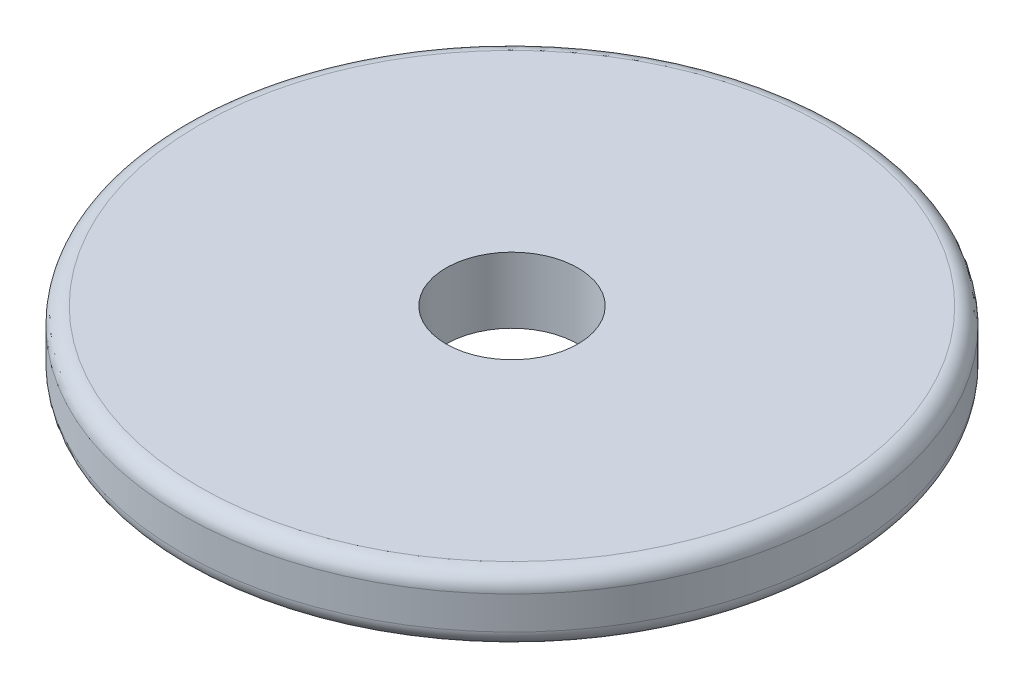
ISO-10303-21;
HEADER;
FILE_DESCRIPTION(('STEP AP214'),'2;1');
FILE_NAME('part.step','',(''),(''),'','','');
FILE_SCHEMA(('AUTOMOTIVE_DESIGN { 1 0 10303 214 1 1 1 1 }'));
ENDSEC;
DATA;
#1=APPLICATION_CONTEXT('core data for automotive mechanical design processes');
#2=APPLICATION_PROTOCOL_DEFINITION('international standard','automotive_design',2000,#1);
#3=PRODUCT_CONTEXT('',#1,'mechanical');
#4=PRODUCT('Part','Part','',(#3));
#5=PRODUCT_RELATED_PRODUCT_CATEGORY('part','',(#4));
#6=PRODUCT_DEFINITION_FORMATION('','',#4);
#7=PRODUCT_DEFINITION_CONTEXT('part definition',#1,'design');
#8=PRODUCT_DEFINITION('design','',#6,#7);
#9=PRODUCT_DEFINITION_SHAPE('','',#8);
#10=(LENGTH_UNIT() NAMED_UNIT(*) SI_UNIT(.MILLI.,.METRE.));
#11=(NAMED_UNIT(*) PLANE_ANGLE_UNIT() SI_UNIT($,.RADIAN.));
#12=(NAMED_UNIT(*) SI_UNIT($,.STERADIAN.) SOLID_ANGLE_UNIT());
#13=UNCERTAINTY_MEASURE_WITH_UNIT(LENGTH_MEASURE(1.E-05),#10,'distance_accuracy_value','');
#14=(GEOMETRIC_REPRESENTATION_CONTEXT(3) GLOBAL_UNCERTAINTY_ASSIGNED_CONTEXT((#13)) GLOBAL_UNIT_ASSIGNED_CONTEXT((#10,
#11,#12)) REPRESENTATION_CONTEXT('',''));
#15=CARTESIAN_POINT('',(0.,0.,0.));
#16=DIRECTION('',(0.,0.,1.));
#17=DIRECTION('',(1.,0.,0.));
#18=AXIS2_PLACEMENT_3D('',#15,#16,#17);
#19=CARTESIAN_POINT('',(0.,20.,0.));
#20=DIRECTION('',(0.,1.,0.));
#21=DIRECTION('',(0.,0.,1.));
#22=AXIS2_PLACEMENT_3D('',#19,#20,#21);
#23=PLANE('',#22);
#24=CARTESIAN_POINT('',(0.,20.,0.));
#25=DIRECTION('',(0.,1.,0.));
#26=DIRECTION('',(0.,0.,1.));
#27=AXIS2_PLACEMENT_3D('',#24,#25,#26);
#28=CIRCLE('',#27,95.);
#29=CARTESIAN_POINT('',(0.,20.,95.));
#30=VERTEX_POINT('',#29);
#31=EDGE_CURVE('E10',#30,#30,#28,.T.);
#32=ORIENTED_EDGE('',*,*,#31,.T.);
#33=EDGE_LOOP('',(#32));
#34=FACE_BOUND('',#33,.T.);
#35=CARTESIAN_POINT('',(0.,20.,0.));
#36=DIRECTION('',(0.,1.,0.));
#37=DIRECTION('',(0.,0.,1.));
#38=AXIS2_PLACEMENT_3D('',#35,#36,#37);
#39=CIRCLE('',#38,20.);
#40=CARTESIAN_POINT('',(0.,20.,20.));
#41=VERTEX_POINT('',#40);
#42=EDGE_CURVE('E53',#41,#41,#39,.T.);
#43=ORIENTED_EDGE('',*,*,#42,.F.);
#44=EDGE_LOOP('',(#43));
#45=FACE_BOUND('',#44,.T.);
#46=ADVANCED_FACE('F33',(#34,#45),#23,.T.);
#47=CARTESIAN_POINT('',(0.,0.,0.));
#48=DIRECTION('',(0.,1.,0.));
#49=DIRECTION('',(0.,0.,1.));
#50=AXIS2_PLACEMENT_3D('',#47,#48,#49);
#51=PLANE('',#50);
#52=CARTESIAN_POINT('',(0.,0.,0.));
#53=DIRECTION('',(0.,1.,0.));
#54=DIRECTION('',(0.,0.,1.));
#55=AXIS2_PLACEMENT_3D('',#52,#53,#54);
#56=CIRCLE('',#55,95.);
#57=CARTESIAN_POINT('',(0.,0.,95.));
#58=VERTEX_POINT('',#57);
#59=EDGE_CURVE('E40',#58,#58,#56,.F.);
#60=ORIENTED_EDGE('',*,*,#59,.T.);
#61=EDGE_LOOP('',(#60));
#62=FACE_BOUND('',#61,.T.);
#63=CARTESIAN_POINT('',(0.,0.,0.));
#64=DIRECTION('',(0.,1.,0.));
#65=DIRECTION('',(0.,0.,1.));
#66=AXIS2_PLACEMENT_3D('',#63,#64,#65);
#67=CIRCLE('',#66,20.);
#68=CARTESIAN_POINT('',(0.,0.,20.));
#69=VERTEX_POINT('',#68);
#70=EDGE_CURVE('E54',#69,#69,#67,.T.);
#71=ORIENTED_EDGE('',*,*,#70,.T.);
#72=EDGE_LOOP('',(#71));
#73=FACE_BOUND('',#72,.T.);
#74=ADVANCED_FACE('F64',(#62,#73),#51,.F.);
#75=CARTESIAN_POINT('',(0.,20.,0.));
#76=DIRECTION('',(0.,-1.,0.));
#77=DIRECTION('',(0.,0.,-1.));
#78=AXIS2_PLACEMENT_3D('',#75,#76,#77);
#79=CYLINDRICAL_SURFACE('',#78,100.);
#80=CARTESIAN_POINT('',(0.,5.,0.));
#81=DIRECTION('',(0.,1.,0.));
#82=DIRECTION('',(0.,0.,1.));
#83=AXIS2_PLACEMENT_3D('',#80,#81,#82);
#84=CIRCLE('',#83,100.);
#85=CARTESIAN_POINT('',(0.,5.,100.));
#86=VERTEX_POINT('',#85);
#87=EDGE_CURVE('E44',#86,#86,#84,.T.);
#88=ORIENTED_EDGE('',*,*,#87,.T.);
#89=EDGE_LOOP('',(#88));
#90=FACE_BOUND('',#89,.T.);
#91=CARTESIAN_POINT('',(0.,15.,0.));
#92=DIRECTION('',(0.,1.,0.));
#93=DIRECTION('',(0.,0.,1.));
#94=AXIS2_PLACEMENT_3D('',#91,#92,#93);
#95=CIRCLE('',#94,100.);
#96=CARTESIAN_POINT('',(0.,15.,100.));
#97=VERTEX_POINT('',#96);
#98=EDGE_CURVE('E48',#97,#97,#95,.F.);
#99=ORIENTED_EDGE('',*,*,#98,.T.);
#100=EDGE_LOOP('',(#99));
#101=FACE_BOUND('',#100,.T.);
#102=ADVANCED_FACE('F69',(#90,#101),#79,.T.);
#103=CARTESIAN_POINT('',(0.,20.,0.));
#104=DIRECTION('',(0.,-1.,0.));
#105=DIRECTION('',(0.,0.,-1.));
#106=AXIS2_PLACEMENT_3D('',#103,#104,#105);
#107=CYLINDRICAL_SURFACE('',#106,20.);
#108=ORIENTED_EDGE('',*,*,#42,.T.);
#109=EDGE_LOOP('',(#108));
#110=FACE_BOUND('',#109,.T.);
#111=ORIENTED_EDGE('',*,*,#70,.F.);
#112=EDGE_LOOP('',(#111));
#113=FACE_BOUND('',#112,.T.);
#114=ADVANCED_FACE('F60',(#110,#113),#107,.F.);
#115=CARTESIAN_POINT('',(0.,5.,0.));
#116=DIRECTION('',(0.,1.,0.));
#117=DIRECTION('',(0.,0.,1.));
#118=AXIS2_PLACEMENT_3D('',#115,#116,#117);
#119=TOROIDAL_SURFACE('',#118,95.,5.);
#120=ORIENTED_EDGE('',*,*,#59,.F.);
#121=EDGE_LOOP('',(#120));
#122=FACE_BOUND('',#121,.T.);
#123=ORIENTED_EDGE('',*,*,#87,.F.);
#124=EDGE_LOOP('',(#123));
#125=FACE_BOUND('',#124,.T.);
#126=ADVANCED_FACE('F75',(#122,#125),#119,.T.);
#127=CARTESIAN_POINT('',(0.,15.,0.));
#128=DIRECTION('',(0.,1.,0.));
#129=DIRECTION('',(0.,0.,1.));
#130=AXIS2_PLACEMENT_3D('',#127,#128,#129);
#131=TOROIDAL_SURFACE('',#130,95.,5.);
#132=ORIENTED_EDGE('',*,*,#98,.F.);
#133=EDGE_LOOP('',(#132));
#134=FACE_BOUND('',#133,.T.);
#135=ORIENTED_EDGE('',*,*,#31,.F.);
#136=EDGE_LOOP('',(#135));
#137=FACE_BOUND('',#136,.T.);
#138=ADVANCED_FACE('F35',(#134,#137),#131,.T.);
#139=CLOSED_SHELL('',(#46,#74,#102,#114,#126,#138));
#140=MANIFOLD_SOLID_BREP('B2',#139);
#141=ADVANCED_BREP_SHAPE_REPRESENTATION('',(#18,#140),#14);
#142=SHAPE_DEFINITION_REPRESENTATION(#9,#141);
ENDSEC;
END-ISO-10303-21;
